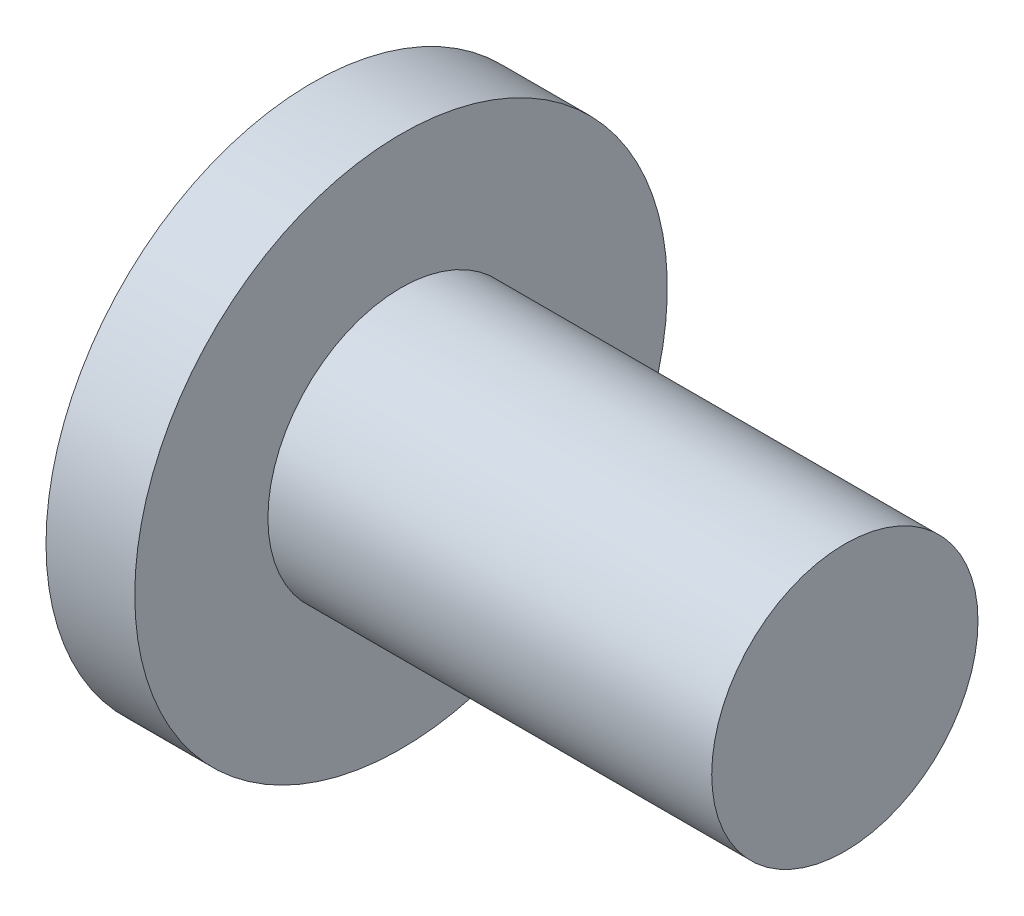
ISO-10303-21;
HEADER;
FILE_DESCRIPTION(('STEP AP214'),'2;1');
FILE_NAME('part.step','',(''),(''),'','','');
FILE_SCHEMA(('AUTOMOTIVE_DESIGN { 1 0 10303 214 1 1 1 1 }'));
ENDSEC;
DATA;
#1=APPLICATION_CONTEXT('core data for automotive mechanical design processes');
#2=APPLICATION_PROTOCOL_DEFINITION('international standard','automotive_design',2000,#1);
#3=PRODUCT_CONTEXT('',#1,'mechanical');
#4=PRODUCT('Part','Part','',(#3));
#5=PRODUCT_RELATED_PRODUCT_CATEGORY('part','',(#4));
#6=PRODUCT_DEFINITION_FORMATION('','',#4);
#7=PRODUCT_DEFINITION_CONTEXT('part definition',#1,'design');
#8=PRODUCT_DEFINITION('design','',#6,#7);
#9=PRODUCT_DEFINITION_SHAPE('','',#8);
#10=(LENGTH_UNIT() NAMED_UNIT(*) SI_UNIT(.MILLI.,.METRE.));
#11=(NAMED_UNIT(*) PLANE_ANGLE_UNIT() SI_UNIT($,.RADIAN.));
#12=(NAMED_UNIT(*) SI_UNIT($,.STERADIAN.) SOLID_ANGLE_UNIT());
#13=UNCERTAINTY_MEASURE_WITH_UNIT(LENGTH_MEASURE(1.E-05),#10,'distance_accuracy_value','');
#14=(GEOMETRIC_REPRESENTATION_CONTEXT(3) GLOBAL_UNCERTAINTY_ASSIGNED_CONTEXT((#13)) GLOBAL_UNIT_ASSIGNED_CONTEXT((#10,
#11,#12)) REPRESENTATION_CONTEXT('',''));
#15=CARTESIAN_POINT('',(0.,0.,0.));
#16=DIRECTION('',(0.,0.,1.));
#17=DIRECTION('',(1.,0.,0.));
#18=AXIS2_PLACEMENT_3D('',#15,#16,#17);
#19=CARTESIAN_POINT('',(0.,3.,0.));
#20=DIRECTION('',(-1.,0.,0.));
#21=DIRECTION('',(0.,0.,1.));
#22=AXIS2_PLACEMENT_3D('',#19,#20,#21);
#23=PLANE('',#22);
#24=CARTESIAN_POINT('',(0.,0.,0.));
#25=DIRECTION('',(-1.,0.,0.));
#26=DIRECTION('',(0.,0.,1.));
#27=AXIS2_PLACEMENT_3D('',#24,#25,#26);
#28=CIRCLE('',#27,3.);
#29=CARTESIAN_POINT('',(0.,0.,3.));
#30=VERTEX_POINT('',#29);
#31=EDGE_CURVE('E60',#30,#30,#28,.T.);
#32=ORIENTED_EDGE('',*,*,#31,.F.);
#33=EDGE_LOOP('',(#32));
#34=FACE_BOUND('',#33,.T.);
#35=ADVANCED_FACE('F43',(#34),#23,.F.);
#36=CARTESIAN_POINT('',(-12.,0.,0.));
#37=DIRECTION('',(1.,0.,0.));
#38=DIRECTION('',(0.,0.,-1.));
#39=AXIS2_PLACEMENT_3D('',#36,#37,#38);
#40=PLANE('',#39);
#41=CARTESIAN_POINT('',(-12.,0.,0.));
#42=DIRECTION('',(-1.,0.,0.));
#43=DIRECTION('',(0.,0.,1.));
#44=AXIS2_PLACEMENT_3D('',#41,#42,#43);
#45=CIRCLE('',#44,6.);
#46=CARTESIAN_POINT('',(-12.,0.,6.));
#47=VERTEX_POINT('',#46);
#48=EDGE_CURVE('E10',#47,#47,#45,.T.);
#49=ORIENTED_EDGE('',*,*,#48,.T.);
#50=EDGE_LOOP('',(#49));
#51=FACE_BOUND('',#50,.T.);
#52=ADVANCED_FACE('F70',(#51),#40,.F.);
#53=CARTESIAN_POINT('',(0.,0.,0.));
#54=DIRECTION('',(-1.,0.,0.));
#55=DIRECTION('',(0.,0.,1.));
#56=AXIS2_PLACEMENT_3D('',#53,#54,#55);
#57=CYLINDRICAL_SURFACE('',#56,6.);
#58=ORIENTED_EDGE('',*,*,#48,.F.);
#59=EDGE_LOOP('',(#58));
#60=FACE_BOUND('',#59,.T.);
#61=CARTESIAN_POINT('',(-10.,0.,0.));
#62=DIRECTION('',(-1.,0.,0.));
#63=DIRECTION('',(0.,0.,1.));
#64=AXIS2_PLACEMENT_3D('',#61,#62,#63);
#65=CIRCLE('',#64,6.);
#66=CARTESIAN_POINT('',(-10.,0.,6.));
#67=VERTEX_POINT('',#66);
#68=EDGE_CURVE('E50',#67,#67,#65,.T.);
#69=ORIENTED_EDGE('',*,*,#68,.T.);
#70=EDGE_LOOP('',(#69));
#71=FACE_BOUND('',#70,.T.);
#72=ADVANCED_FACE('F74',(#60,#71),#57,.T.);
#73=CARTESIAN_POINT('',(-10.,6.,0.));
#74=DIRECTION('',(-1.,0.,0.));
#75=DIRECTION('',(0.,0.,1.));
#76=AXIS2_PLACEMENT_3D('',#73,#74,#75);
#77=PLANE('',#76);
#78=ORIENTED_EDGE('',*,*,#68,.F.);
#79=EDGE_LOOP('',(#78));
#80=FACE_BOUND('',#79,.T.);
#81=CARTESIAN_POINT('',(-10.,0.,0.));
#82=DIRECTION('',(-1.,0.,0.));
#83=DIRECTION('',(0.,0.,1.));
#84=AXIS2_PLACEMENT_3D('',#81,#82,#83);
#85=CIRCLE('',#84,3.);
#86=CARTESIAN_POINT('',(-10.,0.,3.));
#87=VERTEX_POINT('',#86);
#88=EDGE_CURVE('E55',#87,#87,#85,.T.);
#89=ORIENTED_EDGE('',*,*,#88,.T.);
#90=EDGE_LOOP('',(#89));
#91=FACE_BOUND('',#90,.T.);
#92=ADVANCED_FACE('F78',(#80,#91),#77,.F.);
#93=CARTESIAN_POINT('',(0.,0.,0.));
#94=DIRECTION('',(-1.,0.,0.));
#95=DIRECTION('',(0.,0.,1.));
#96=AXIS2_PLACEMENT_3D('',#93,#94,#95);
#97=CYLINDRICAL_SURFACE('',#96,3.);
#98=ORIENTED_EDGE('',*,*,#88,.F.);
#99=EDGE_LOOP('',(#98));
#100=FACE_BOUND('',#99,.T.);
#101=ORIENTED_EDGE('',*,*,#31,.T.);
#102=EDGE_LOOP('',(#101));
#103=FACE_BOUND('',#102,.T.);
#104=ADVANCED_FACE('F67',(#100,#103),#97,.T.);
#105=CLOSED_SHELL('',(#35,#52,#72,#92,#104));
#106=MANIFOLD_SOLID_BREP('B2',#105);
#107=ADVANCED_BREP_SHAPE_REPRESENTATION('',(#18,#106),#14);
#108=SHAPE_DEFINITION_REPRESENTATION(#9,#107);
ENDSEC;
END-ISO-10303-21;
